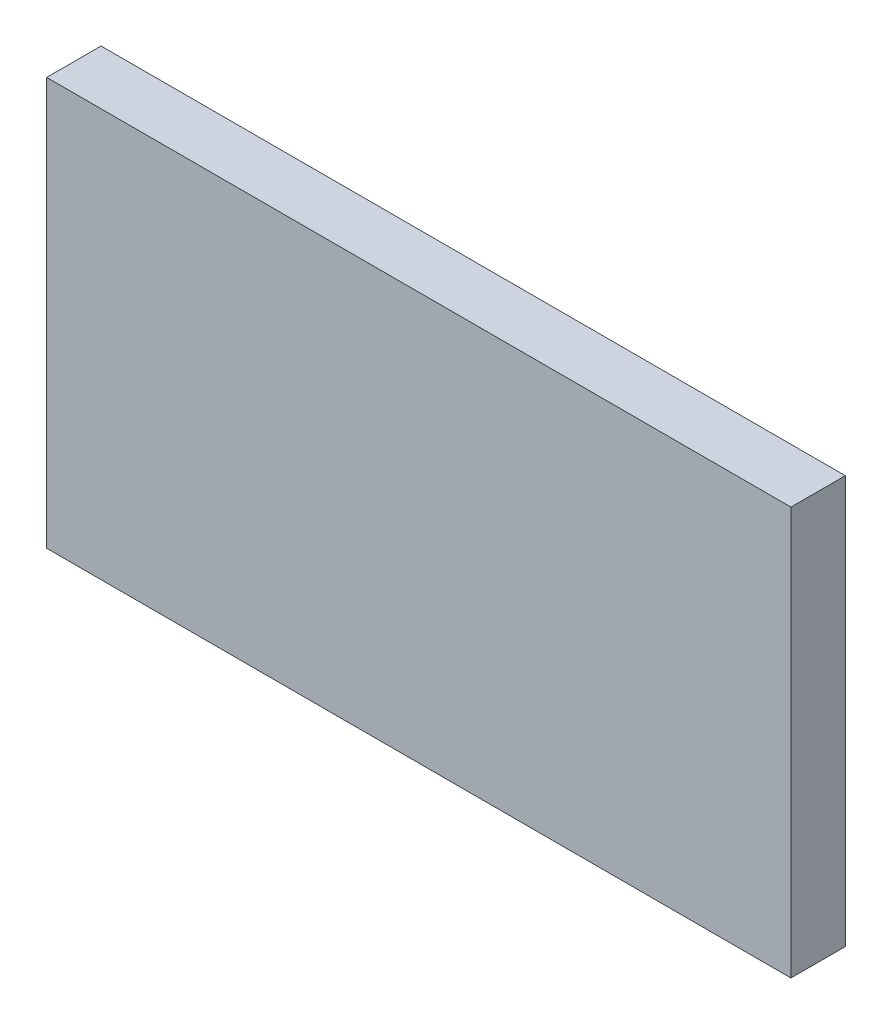
ISO-10303-21;
HEADER;
FILE_DESCRIPTION(('STEP AP214'),'2;1');
FILE_NAME('part.step','',(''),(''),'','','');
FILE_SCHEMA(('AUTOMOTIVE_DESIGN { 1 0 10303 214 1 1 1 1 }'));
ENDSEC;
DATA;
#1=APPLICATION_CONTEXT('core data for automotive mechanical design processes');
#2=APPLICATION_PROTOCOL_DEFINITION('international standard','automotive_design',2000,#1);
#3=PRODUCT_CONTEXT('',#1,'mechanical');
#4=PRODUCT('Part','Part','',(#3));
#5=PRODUCT_RELATED_PRODUCT_CATEGORY('part','',(#4));
#6=PRODUCT_DEFINITION_FORMATION('','',#4);
#7=PRODUCT_DEFINITION_CONTEXT('part definition',#1,'design');
#8=PRODUCT_DEFINITION('design','',#6,#7);
#9=PRODUCT_DEFINITION_SHAPE('','',#8);
#10=(LENGTH_UNIT() NAMED_UNIT(*) SI_UNIT(.MILLI.,.METRE.));
#11=(NAMED_UNIT(*) PLANE_ANGLE_UNIT() SI_UNIT($,.RADIAN.));
#12=(NAMED_UNIT(*) SI_UNIT($,.STERADIAN.) SOLID_ANGLE_UNIT());
#13=UNCERTAINTY_MEASURE_WITH_UNIT(LENGTH_MEASURE(1.E-05),#10,'distance_accuracy_value','');
#14=(GEOMETRIC_REPRESENTATION_CONTEXT(3) GLOBAL_UNCERTAINTY_ASSIGNED_CONTEXT((#13)) GLOBAL_UNIT_ASSIGNED_CONTEXT((#10,
#11,#12)) REPRESENTATION_CONTEXT('',''));
#15=CARTESIAN_POINT('',(0.,0.,0.));
#16=DIRECTION('',(0.,0.,1.));
#17=DIRECTION('',(1.,0.,0.));
#18=AXIS2_PLACEMENT_3D('',#15,#16,#17);
#19=CARTESIAN_POINT('',(-20.0525,15.5175,2.317));
#20=DIRECTION('',(1.,0.,0.));
#21=DIRECTION('',(0.,0.,-1.));
#22=AXIS2_PLACEMENT_3D('',#19,#20,#21);
#23=PLANE('',#22);
#24=DIRECTION('',(0.,-1.,0.));
#25=VECTOR('',#24,1.);
#26=CARTESIAN_POINT('',(-20.0525,15.5175,0.));
#27=LINE('',#26,#25);
#28=CARTESIAN_POINT('',(-20.0525,15.5175,0.));
#29=VERTEX_POINT('',#28);
#30=CARTESIAN_POINT('',(-20.0525,-1.8635,0.));
#31=VERTEX_POINT('',#30);
#32=EDGE_CURVE('E101',#29,#31,#27,.T.);
#33=ORIENTED_EDGE('',*,*,#32,.T.);
#34=DIRECTION('',(0.,0.,-1.));
#35=VECTOR('',#34,1.);
#36=CARTESIAN_POINT('',(-20.0525,-1.8635,2.317));
#37=LINE('',#36,#35);
#38=CARTESIAN_POINT('',(-20.0525,-1.8635,2.317));
#39=VERTEX_POINT('',#38);
#40=EDGE_CURVE('E11',#39,#31,#37,.T.);
#41=ORIENTED_EDGE('',*,*,#40,.F.);
#42=DIRECTION('',(0.,-1.,0.));
#43=VECTOR('',#42,1.);
#44=CARTESIAN_POINT('',(-20.0525,15.5175,2.317));
#45=LINE('',#44,#43);
#46=CARTESIAN_POINT('',(-20.0525,15.5175,2.317));
#47=VERTEX_POINT('',#46);
#48=EDGE_CURVE('E95',#47,#39,#45,.T.);
#49=ORIENTED_EDGE('',*,*,#48,.F.);
#50=DIRECTION('',(0.,0.,-1.));
#51=VECTOR('',#50,1.);
#52=CARTESIAN_POINT('',(-20.0525,15.5175,2.317));
#53=LINE('',#52,#51);
#54=EDGE_CURVE('E99',#47,#29,#53,.T.);
#55=ORIENTED_EDGE('',*,*,#54,.T.);
#56=EDGE_LOOP('',(#33,#41,#49,#55));
#57=FACE_BOUND('',#56,.T.);
#58=ADVANCED_FACE('F41',(#57),#23,.F.);
#59=CARTESIAN_POINT('',(-20.0525,-1.8635,2.317));
#60=DIRECTION('',(0.,1.,0.));
#61=DIRECTION('',(0.,0.,1.));
#62=AXIS2_PLACEMENT_3D('',#59,#60,#61);
#63=PLANE('',#62);
#64=DIRECTION('',(1.,0.,0.));
#65=VECTOR('',#64,1.);
#66=CARTESIAN_POINT('',(-20.0525,-1.8635,0.));
#67=LINE('',#66,#65);
#68=CARTESIAN_POINT('',(11.6665,-1.8635,0.));
#69=VERTEX_POINT('',#68);
#70=EDGE_CURVE('E96',#31,#69,#67,.T.);
#71=ORIENTED_EDGE('',*,*,#70,.T.);
#72=DIRECTION('',(0.,0.,-1.));
#73=VECTOR('',#72,1.);
#74=CARTESIAN_POINT('',(11.6665,-1.8635,2.317));
#75=LINE('',#74,#73);
#76=CARTESIAN_POINT('',(11.6665,-1.8635,2.317));
#77=VERTEX_POINT('',#76);
#78=EDGE_CURVE('E47',#77,#69,#75,.T.);
#79=ORIENTED_EDGE('',*,*,#78,.F.);
#80=DIRECTION('',(1.,0.,0.));
#81=VECTOR('',#80,1.);
#82=CARTESIAN_POINT('',(-20.0525,-1.8635,2.317));
#83=LINE('',#82,#81);
#84=EDGE_CURVE('E90',#39,#77,#83,.T.);
#85=ORIENTED_EDGE('',*,*,#84,.F.);
#86=ORIENTED_EDGE('',*,*,#40,.T.);
#87=EDGE_LOOP('',(#71,#79,#85,#86));
#88=FACE_BOUND('',#87,.T.);
#89=ADVANCED_FACE('F94',(#88),#63,.F.);
#90=CARTESIAN_POINT('',(11.6665,-1.8635,2.317));
#91=DIRECTION('',(-1.,0.,0.));
#92=DIRECTION('',(0.,0.,1.));
#93=AXIS2_PLACEMENT_3D('',#90,#91,#92);
#94=PLANE('',#93);
#95=DIRECTION('',(0.,1.,0.));
#96=VECTOR('',#95,1.);
#97=CARTESIAN_POINT('',(11.6665,-1.8635,0.));
#98=LINE('',#97,#96);
#99=CARTESIAN_POINT('',(11.6665,15.5175,0.));
#100=VERTEX_POINT('',#99);
#101=EDGE_CURVE('E71',#69,#100,#98,.T.);
#102=ORIENTED_EDGE('',*,*,#101,.T.);
#103=DIRECTION('',(0.,0.,-1.));
#104=VECTOR('',#103,1.);
#105=CARTESIAN_POINT('',(11.6665,15.5175,2.317));
#106=LINE('',#105,#104);
#107=CARTESIAN_POINT('',(11.6665,15.5175,2.317));
#108=VERTEX_POINT('',#107);
#109=EDGE_CURVE('E100',#108,#100,#106,.T.);
#110=ORIENTED_EDGE('',*,*,#109,.F.);
#111=DIRECTION('',(0.,1.,0.));
#112=VECTOR('',#111,1.);
#113=CARTESIAN_POINT('',(11.6665,-1.8635,2.317));
#114=LINE('',#113,#112);
#115=EDGE_CURVE('E89',#77,#108,#114,.T.);
#116=ORIENTED_EDGE('',*,*,#115,.F.);
#117=ORIENTED_EDGE('',*,*,#78,.T.);
#118=EDGE_LOOP('',(#102,#110,#116,#117));
#119=FACE_BOUND('',#118,.T.);
#120=ADVANCED_FACE('F97',(#119),#94,.F.);
#121=CARTESIAN_POINT('',(11.6665,15.5175,2.317));
#122=DIRECTION('',(0.,-1.,0.));
#123=DIRECTION('',(0.,0.,-1.));
#124=AXIS2_PLACEMENT_3D('',#121,#122,#123);
#125=PLANE('',#124);
#126=DIRECTION('',(-1.,0.,0.));
#127=VECTOR('',#126,1.);
#128=CARTESIAN_POINT('',(11.6665,15.5175,0.));
#129=LINE('',#128,#127);
#130=EDGE_CURVE('E79',#100,#29,#129,.T.);
#131=ORIENTED_EDGE('',*,*,#130,.T.);
#132=ORIENTED_EDGE('',*,*,#54,.F.);
#133=DIRECTION('',(-1.,0.,0.));
#134=VECTOR('',#133,1.);
#135=CARTESIAN_POINT('',(11.6665,15.5175,2.317));
#136=LINE('',#135,#134);
#137=EDGE_CURVE('E60',#108,#47,#136,.T.);
#138=ORIENTED_EDGE('',*,*,#137,.F.);
#139=ORIENTED_EDGE('',*,*,#109,.T.);
#140=EDGE_LOOP('',(#131,#132,#138,#139));
#141=FACE_BOUND('',#140,.T.);
#142=ADVANCED_FACE('F112',(#141),#125,.F.);
#143=CARTESIAN_POINT('',(0.,0.,2.317));
#144=DIRECTION('',(0.,0.,1.));
#145=DIRECTION('',(1.,0.,0.));
#146=AXIS2_PLACEMENT_3D('',#143,#144,#145);
#147=PLANE('',#146);
#148=ORIENTED_EDGE('',*,*,#48,.T.);
#149=ORIENTED_EDGE('',*,*,#84,.T.);
#150=ORIENTED_EDGE('',*,*,#115,.T.);
#151=ORIENTED_EDGE('',*,*,#137,.T.);
#152=EDGE_LOOP('',(#148,#149,#150,#151));
#153=FACE_BOUND('',#152,.T.);
#154=ADVANCED_FACE('F88',(#153),#147,.T.);
#155=CARTESIAN_POINT('',(0.,0.,0.));
#156=DIRECTION('',(0.,0.,1.));
#157=DIRECTION('',(1.,0.,0.));
#158=AXIS2_PLACEMENT_3D('',#155,#156,#157);
#159=PLANE('',#158);
#160=ORIENTED_EDGE('',*,*,#32,.F.);
#161=ORIENTED_EDGE('',*,*,#130,.F.);
#162=ORIENTED_EDGE('',*,*,#101,.F.);
#163=ORIENTED_EDGE('',*,*,#70,.F.);
#164=EDGE_LOOP('',(#160,#161,#162,#163));
#165=FACE_BOUND('',#164,.T.);
#166=ADVANCED_FACE('F114',(#165),#159,.F.);
#167=CLOSED_SHELL('',(#58,#89,#120,#142,#154,#166));
#168=MANIFOLD_SOLID_BREP('B2',#167);
#169=ADVANCED_BREP_SHAPE_REPRESENTATION('',(#18,#168),#14);
#170=SHAPE_DEFINITION_REPRESENTATION(#9,#169);
ENDSEC;
END-ISO-10303-21;
